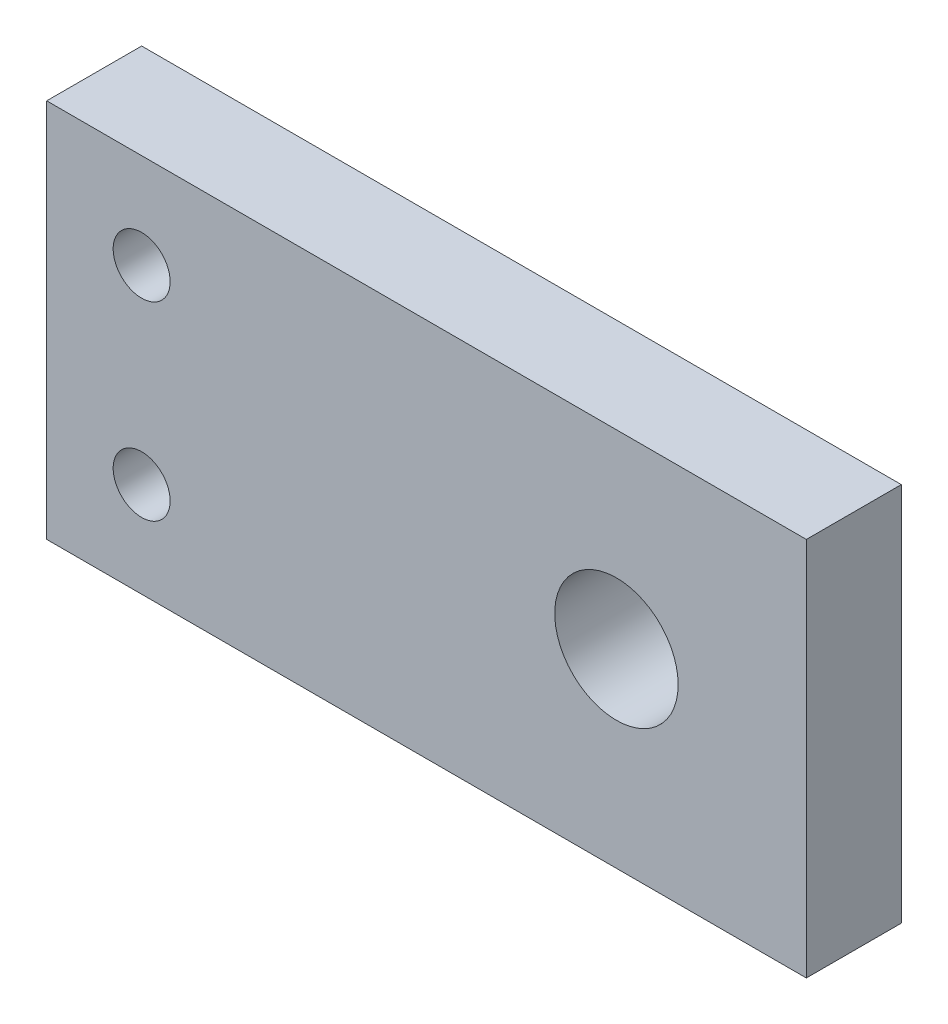
ISO-10303-21;
HEADER;
FILE_DESCRIPTION(('STEP AP214'),'2;1');
FILE_NAME('part.step','',(''),(''),'','','');
FILE_SCHEMA(('AUTOMOTIVE_DESIGN { 1 0 10303 214 1 1 1 1 }'));
ENDSEC;
DATA;
#1=APPLICATION_CONTEXT('core data for automotive mechanical design processes');
#2=APPLICATION_PROTOCOL_DEFINITION('international standard','automotive_design',2000,#1);
#3=PRODUCT_CONTEXT('',#1,'mechanical');
#4=PRODUCT('Part','Part','',(#3));
#5=PRODUCT_RELATED_PRODUCT_CATEGORY('part','',(#4));
#6=PRODUCT_DEFINITION_FORMATION('','',#4);
#7=PRODUCT_DEFINITION_CONTEXT('part definition',#1,'design');
#8=PRODUCT_DEFINITION('design','',#6,#7);
#9=PRODUCT_DEFINITION_SHAPE('','',#8);
#10=(LENGTH_UNIT() NAMED_UNIT(*) SI_UNIT(.MILLI.,.METRE.));
#11=(NAMED_UNIT(*) PLANE_ANGLE_UNIT() SI_UNIT($,.RADIAN.));
#12=(NAMED_UNIT(*) SI_UNIT($,.STERADIAN.) SOLID_ANGLE_UNIT());
#13=UNCERTAINTY_MEASURE_WITH_UNIT(LENGTH_MEASURE(1.E-05),#10,'distance_accuracy_value','');
#14=(GEOMETRIC_REPRESENTATION_CONTEXT(3) GLOBAL_UNCERTAINTY_ASSIGNED_CONTEXT((#13)) GLOBAL_UNIT_ASSIGNED_CONTEXT((#10,
#11,#12)) REPRESENTATION_CONTEXT('',''));
#15=CARTESIAN_POINT('',(0.,0.,0.));
#16=DIRECTION('',(0.,0.,1.));
#17=DIRECTION('',(1.,0.,0.));
#18=AXIS2_PLACEMENT_3D('',#15,#16,#17);
#19=CARTESIAN_POINT('',(0.,0.,5.));
#20=DIRECTION('',(1.,0.,0.));
#21=DIRECTION('',(0.,0.,-1.));
#22=AXIS2_PLACEMENT_3D('',#19,#20,#21);
#23=PLANE('',#22);
#24=DIRECTION('',(0.,-1.,0.));
#25=VECTOR('',#24,1.);
#26=CARTESIAN_POINT('',(0.,0.,0.));
#27=LINE('',#26,#25);
#28=CARTESIAN_POINT('',(0.,20.,0.));
#29=VERTEX_POINT('',#28);
#30=CARTESIAN_POINT('',(0.,0.,0.));
#31=VERTEX_POINT('',#30);
#32=EDGE_CURVE('E96',#29,#31,#27,.T.);
#33=ORIENTED_EDGE('',*,*,#32,.T.);
#34=DIRECTION('',(0.,0.,-1.));
#35=VECTOR('',#34,1.);
#36=CARTESIAN_POINT('',(0.,0.,5.));
#37=LINE('',#36,#35);
#38=CARTESIAN_POINT('',(0.,0.,5.));
#39=VERTEX_POINT('',#38);
#40=EDGE_CURVE('E11',#39,#31,#37,.T.);
#41=ORIENTED_EDGE('',*,*,#40,.F.);
#42=DIRECTION('',(0.,-1.,0.));
#43=VECTOR('',#42,1.);
#44=CARTESIAN_POINT('',(0.,0.,5.));
#45=LINE('',#44,#43);
#46=CARTESIAN_POINT('',(0.,20.,5.));
#47=VERTEX_POINT('',#46);
#48=EDGE_CURVE('E84',#47,#39,#45,.T.);
#49=ORIENTED_EDGE('',*,*,#48,.F.);
#50=DIRECTION('',(0.,0.,-1.));
#51=VECTOR('',#50,1.);
#52=CARTESIAN_POINT('',(0.,20.,5.));
#53=LINE('',#52,#51);
#54=EDGE_CURVE('E92',#47,#29,#53,.T.);
#55=ORIENTED_EDGE('',*,*,#54,.T.);
#56=EDGE_LOOP('',(#33,#41,#49,#55));
#57=FACE_BOUND('',#56,.T.);
#58=ADVANCED_FACE('F33',(#57),#23,.F.);
#59=CARTESIAN_POINT('',(0.,0.,5.));
#60=DIRECTION('',(0.,1.,0.));
#61=DIRECTION('',(0.,0.,1.));
#62=AXIS2_PLACEMENT_3D('',#59,#60,#61);
#63=PLANE('',#62);
#64=DIRECTION('',(1.,0.,0.));
#65=VECTOR('',#64,1.);
#66=CARTESIAN_POINT('',(0.,0.,0.));
#67=LINE('',#66,#65);
#68=CARTESIAN_POINT('',(40.,0.,0.));
#69=VERTEX_POINT('',#68);
#70=EDGE_CURVE('E88',#31,#69,#67,.T.);
#71=ORIENTED_EDGE('',*,*,#70,.T.);
#72=DIRECTION('',(0.,0.,-1.));
#73=VECTOR('',#72,1.);
#74=CARTESIAN_POINT('',(40.,0.,5.));
#75=LINE('',#74,#73);
#76=CARTESIAN_POINT('',(40.,0.,5.));
#77=VERTEX_POINT('',#76);
#78=EDGE_CURVE('E41',#77,#69,#75,.T.);
#79=ORIENTED_EDGE('',*,*,#78,.F.);
#80=DIRECTION('',(1.,0.,0.));
#81=VECTOR('',#80,1.);
#82=CARTESIAN_POINT('',(0.,0.,5.));
#83=LINE('',#82,#81);
#84=EDGE_CURVE('E79',#39,#77,#83,.T.);
#85=ORIENTED_EDGE('',*,*,#84,.F.);
#86=ORIENTED_EDGE('',*,*,#40,.T.);
#87=EDGE_LOOP('',(#71,#79,#85,#86));
#88=FACE_BOUND('',#87,.T.);
#89=ADVANCED_FACE('F87',(#88),#63,.F.);
#90=CARTESIAN_POINT('',(40.,0.,5.));
#91=DIRECTION('',(-1.,0.,0.));
#92=DIRECTION('',(0.,0.,1.));
#93=AXIS2_PLACEMENT_3D('',#90,#91,#92);
#94=PLANE('',#93);
#95=DIRECTION('',(0.,1.,0.));
#96=VECTOR('',#95,1.);
#97=CARTESIAN_POINT('',(40.,0.,0.));
#98=LINE('',#97,#96);
#99=CARTESIAN_POINT('',(40.,20.,0.));
#100=VERTEX_POINT('',#99);
#101=EDGE_CURVE('E66',#69,#100,#98,.T.);
#102=ORIENTED_EDGE('',*,*,#101,.T.);
#103=DIRECTION('',(0.,0.,-1.));
#104=VECTOR('',#103,1.);
#105=CARTESIAN_POINT('',(40.,20.,5.));
#106=LINE('',#105,#104);
#107=CARTESIAN_POINT('',(40.,20.,5.));
#108=VERTEX_POINT('',#107);
#109=EDGE_CURVE('E89',#108,#100,#106,.T.);
#110=ORIENTED_EDGE('',*,*,#109,.F.);
#111=DIRECTION('',(0.,1.,0.));
#112=VECTOR('',#111,1.);
#113=CARTESIAN_POINT('',(40.,0.,5.));
#114=LINE('',#113,#112);
#115=EDGE_CURVE('E82',#77,#108,#114,.T.);
#116=ORIENTED_EDGE('',*,*,#115,.F.);
#117=ORIENTED_EDGE('',*,*,#78,.T.);
#118=EDGE_LOOP('',(#102,#110,#116,#117));
#119=FACE_BOUND('',#118,.T.);
#120=ADVANCED_FACE('F90',(#119),#94,.F.);
#121=CARTESIAN_POINT('',(0.,20.,5.));
#122=DIRECTION('',(0.,-1.,0.));
#123=DIRECTION('',(0.,0.,-1.));
#124=AXIS2_PLACEMENT_3D('',#121,#122,#123);
#125=PLANE('',#124);
#126=DIRECTION('',(-1.,0.,0.));
#127=VECTOR('',#126,1.);
#128=CARTESIAN_POINT('',(0.,20.,0.));
#129=LINE('',#128,#127);
#130=EDGE_CURVE('E72',#100,#29,#129,.T.);
#131=ORIENTED_EDGE('',*,*,#130,.T.);
#132=ORIENTED_EDGE('',*,*,#54,.F.);
#133=DIRECTION('',(-1.,0.,0.));
#134=VECTOR('',#133,1.);
#135=CARTESIAN_POINT('',(0.,20.,5.));
#136=LINE('',#135,#134);
#137=EDGE_CURVE('E49',#108,#47,#136,.T.);
#138=ORIENTED_EDGE('',*,*,#137,.F.);
#139=ORIENTED_EDGE('',*,*,#109,.T.);
#140=EDGE_LOOP('',(#131,#132,#138,#139));
#141=FACE_BOUND('',#140,.T.);
#142=ADVANCED_FACE('F104',(#141),#125,.F.);
#143=CARTESIAN_POINT('',(0.,0.,5.));
#144=DIRECTION('',(0.,0.,-1.));
#145=DIRECTION('',(-1.,0.,0.));
#146=AXIS2_PLACEMENT_3D('',#143,#144,#145);
#147=PLANE('',#146);
#148=CARTESIAN_POINT('',(5.,5.,5.));
#149=DIRECTION('',(0.,0.,1.));
#150=DIRECTION('',(1.,0.,0.));
#151=AXIS2_PLACEMENT_3D('',#148,#149,#150);
#152=CIRCLE('',#151,1.5);
#153=CARTESIAN_POINT('',(6.5,5.,5.));
#154=VERTEX_POINT('',#153);
#155=EDGE_CURVE('E122',#154,#154,#152,.T.);
#156=ORIENTED_EDGE('',*,*,#155,.F.);
#157=EDGE_LOOP('',(#156));
#158=FACE_BOUND('',#157,.T.);
#159=CARTESIAN_POINT('',(5.,15.,5.));
#160=DIRECTION('',(0.,0.,1.));
#161=DIRECTION('',(1.,0.,0.));
#162=AXIS2_PLACEMENT_3D('',#159,#160,#161);
#163=CIRCLE('',#162,1.5);
#164=CARTESIAN_POINT('',(6.5,15.,5.));
#165=VERTEX_POINT('',#164);
#166=EDGE_CURVE('E116',#165,#165,#163,.T.);
#167=ORIENTED_EDGE('',*,*,#166,.F.);
#168=EDGE_LOOP('',(#167));
#169=FACE_BOUND('',#168,.T.);
#170=CARTESIAN_POINT('',(30.,10.,5.));
#171=DIRECTION('',(0.,0.,1.));
#172=DIRECTION('',(1.,0.,0.));
#173=AXIS2_PLACEMENT_3D('',#170,#171,#172);
#174=CIRCLE('',#173,3.25);
#175=CARTESIAN_POINT('',(33.25,10.,5.));
#176=VERTEX_POINT('',#175);
#177=EDGE_CURVE('E110',#176,#176,#174,.T.);
#178=ORIENTED_EDGE('',*,*,#177,.F.);
#179=EDGE_LOOP('',(#178));
#180=FACE_BOUND('',#179,.T.);
#181=ORIENTED_EDGE('',*,*,#48,.T.);
#182=ORIENTED_EDGE('',*,*,#84,.T.);
#183=ORIENTED_EDGE('',*,*,#115,.T.);
#184=ORIENTED_EDGE('',*,*,#137,.T.);
#185=EDGE_LOOP('',(#181,#182,#183,#184));
#186=FACE_BOUND('',#185,.T.);
#187=ADVANCED_FACE('F80',(#158,#169,#180,#186),#147,.F.);
#188=CARTESIAN_POINT('',(0.,0.,0.));
#189=DIRECTION('',(0.,0.,-1.));
#190=DIRECTION('',(-1.,0.,0.));
#191=AXIS2_PLACEMENT_3D('',#188,#189,#190);
#192=PLANE('',#191);
#193=CARTESIAN_POINT('',(5.,5.,0.));
#194=DIRECTION('',(0.,0.,1.));
#195=DIRECTION('',(1.,0.,0.));
#196=AXIS2_PLACEMENT_3D('',#193,#194,#195);
#197=CIRCLE('',#196,1.5);
#198=CARTESIAN_POINT('',(6.5,5.,0.));
#199=VERTEX_POINT('',#198);
#200=EDGE_CURVE('E119',#199,#199,#197,.T.);
#201=ORIENTED_EDGE('',*,*,#200,.T.);
#202=EDGE_LOOP('',(#201));
#203=FACE_BOUND('',#202,.T.);
#204=CARTESIAN_POINT('',(5.,15.,0.));
#205=DIRECTION('',(0.,0.,1.));
#206=DIRECTION('',(1.,0.,0.));
#207=AXIS2_PLACEMENT_3D('',#204,#205,#206);
#208=CIRCLE('',#207,1.5);
#209=CARTESIAN_POINT('',(6.5,15.,0.));
#210=VERTEX_POINT('',#209);
#211=EDGE_CURVE('E113',#210,#210,#208,.T.);
#212=ORIENTED_EDGE('',*,*,#211,.T.);
#213=EDGE_LOOP('',(#212));
#214=FACE_BOUND('',#213,.T.);
#215=CARTESIAN_POINT('',(30.,10.,0.));
#216=DIRECTION('',(0.,0.,1.));
#217=DIRECTION('',(1.,0.,0.));
#218=AXIS2_PLACEMENT_3D('',#215,#216,#217);
#219=CIRCLE('',#218,3.25);
#220=CARTESIAN_POINT('',(33.25,10.,0.));
#221=VERTEX_POINT('',#220);
#222=EDGE_CURVE('E99',#221,#221,#219,.T.);
#223=ORIENTED_EDGE('',*,*,#222,.T.);
#224=EDGE_LOOP('',(#223));
#225=FACE_BOUND('',#224,.T.);
#226=ORIENTED_EDGE('',*,*,#32,.F.);
#227=ORIENTED_EDGE('',*,*,#130,.F.);
#228=ORIENTED_EDGE('',*,*,#101,.F.);
#229=ORIENTED_EDGE('',*,*,#70,.F.);
#230=EDGE_LOOP('',(#226,#227,#228,#229));
#231=FACE_BOUND('',#230,.T.);
#232=ADVANCED_FACE('F107',(#203,#214,#225,#231),#192,.T.);
#233=CARTESIAN_POINT('',(30.,10.,0.));
#234=DIRECTION('',(0.,0.,1.));
#235=DIRECTION('',(1.,0.,0.));
#236=AXIS2_PLACEMENT_3D('',#233,#234,#235);
#237=CYLINDRICAL_SURFACE('',#236,3.25);
#238=ORIENTED_EDGE('',*,*,#222,.F.);
#239=EDGE_LOOP('',(#238));
#240=FACE_BOUND('',#239,.T.);
#241=ORIENTED_EDGE('',*,*,#177,.T.);
#242=EDGE_LOOP('',(#241));
#243=FACE_BOUND('',#242,.T.);
#244=ADVANCED_FACE('F144',(#240,#243),#237,.F.);
#245=CARTESIAN_POINT('',(5.,15.,0.));
#246=DIRECTION('',(0.,0.,1.));
#247=DIRECTION('',(1.,0.,0.));
#248=AXIS2_PLACEMENT_3D('',#245,#246,#247);
#249=CYLINDRICAL_SURFACE('',#248,1.5);
#250=ORIENTED_EDGE('',*,*,#211,.F.);
#251=EDGE_LOOP('',(#250));
#252=FACE_BOUND('',#251,.T.);
#253=ORIENTED_EDGE('',*,*,#166,.T.);
#254=EDGE_LOOP('',(#253));
#255=FACE_BOUND('',#254,.T.);
#256=ADVANCED_FACE('F133',(#252,#255),#249,.F.);
#257=CARTESIAN_POINT('',(5.,5.,0.));
#258=DIRECTION('',(0.,0.,1.));
#259=DIRECTION('',(1.,0.,0.));
#260=AXIS2_PLACEMENT_3D('',#257,#258,#259);
#261=CYLINDRICAL_SURFACE('',#260,1.5);
#262=ORIENTED_EDGE('',*,*,#200,.F.);
#263=EDGE_LOOP('',(#262));
#264=FACE_BOUND('',#263,.T.);
#265=ORIENTED_EDGE('',*,*,#155,.T.);
#266=EDGE_LOOP('',(#265));
#267=FACE_BOUND('',#266,.T.);
#268=ADVANCED_FACE('F130',(#264,#267),#261,.F.);
#269=CLOSED_SHELL('',(#58,#89,#120,#142,#187,#232,#244,#256,#268));
#270=MANIFOLD_SOLID_BREP('B2',#269);
#271=ADVANCED_BREP_SHAPE_REPRESENTATION('',(#18,#270),#14);
#272=SHAPE_DEFINITION_REPRESENTATION(#9,#271);
ENDSEC;
END-ISO-10303-21;
